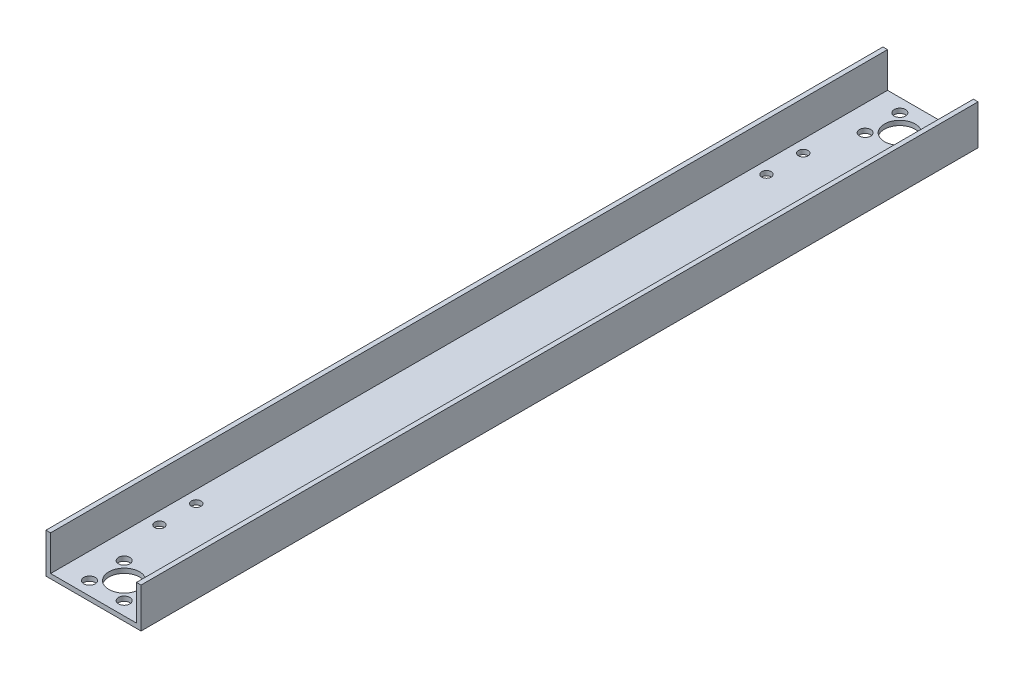
ISO-10303-21;
HEADER;
FILE_DESCRIPTION(('STEP AP214'),'2;1');
FILE_NAME('part.step','',(''),(''),'','','');
FILE_SCHEMA(('AUTOMOTIVE_DESIGN { 1 0 10303 214 1 1 1 1 }'));
ENDSEC;
DATA;
#1=APPLICATION_CONTEXT('core data for automotive mechanical design processes');
#2=APPLICATION_PROTOCOL_DEFINITION('international standard','automotive_design',2000,#1);
#3=PRODUCT_CONTEXT('',#1,'mechanical');
#4=PRODUCT('Part','Part','',(#3));
#5=PRODUCT_RELATED_PRODUCT_CATEGORY('part','',(#4));
#6=PRODUCT_DEFINITION_FORMATION('','',#4);
#7=PRODUCT_DEFINITION_CONTEXT('part definition',#1,'design');
#8=PRODUCT_DEFINITION('design','',#6,#7);
#9=PRODUCT_DEFINITION_SHAPE('','',#8);
#10=(LENGTH_UNIT() NAMED_UNIT(*) SI_UNIT(.MILLI.,.METRE.));
#11=(NAMED_UNIT(*) PLANE_ANGLE_UNIT() SI_UNIT($,.RADIAN.));
#12=(NAMED_UNIT(*) SI_UNIT($,.STERADIAN.) SOLID_ANGLE_UNIT());
#13=UNCERTAINTY_MEASURE_WITH_UNIT(LENGTH_MEASURE(1.E-05),#10,'distance_accuracy_value','');
#14=(GEOMETRIC_REPRESENTATION_CONTEXT(3) GLOBAL_UNCERTAINTY_ASSIGNED_CONTEXT((#13)) GLOBAL_UNIT_ASSIGNED_CONTEXT((#10,
#11,#12)) REPRESENTATION_CONTEXT('',''));
#15=CARTESIAN_POINT('',(0.,0.,0.));
#16=DIRECTION('',(0.,0.,1.));
#17=DIRECTION('',(1.,0.,0.));
#18=AXIS2_PLACEMENT_3D('',#15,#16,#17);
#19=CARTESIAN_POINT('',(15.5,6.5,273.));
#20=DIRECTION('',(-1.,0.,0.));
#21=DIRECTION('',(0.,0.,1.));
#22=AXIS2_PLACEMENT_3D('',#19,#20,#21);
#23=PLANE('',#22);
#24=DIRECTION('',(0.,1.,0.));
#25=VECTOR('',#24,1.);
#26=CARTESIAN_POINT('',(15.5,6.5,0.));
#27=LINE('',#26,#25);
#28=CARTESIAN_POINT('',(15.5,-6.5,0.));
#29=VERTEX_POINT('',#28);
#30=CARTESIAN_POINT('',(15.5,6.5,0.));
#31=VERTEX_POINT('',#30);
#32=EDGE_CURVE('E130',#29,#31,#27,.T.);
#33=ORIENTED_EDGE('',*,*,#32,.T.);
#34=DIRECTION('',(0.,0.,-1.));
#35=VECTOR('',#34,1.);
#36=CARTESIAN_POINT('',(15.5,6.5,273.));
#37=LINE('',#36,#35);
#38=CARTESIAN_POINT('',(15.5,6.5,273.));
#39=VERTEX_POINT('',#38);
#40=EDGE_CURVE('E11',#39,#31,#37,.T.);
#41=ORIENTED_EDGE('',*,*,#40,.F.);
#42=DIRECTION('',(0.,1.,0.));
#43=VECTOR('',#42,1.);
#44=CARTESIAN_POINT('',(15.5,6.5,273.));
#45=LINE('',#44,#43);
#46=CARTESIAN_POINT('',(15.5,-6.5,273.));
#47=VERTEX_POINT('',#46);
#48=EDGE_CURVE('E145',#47,#39,#45,.T.);
#49=ORIENTED_EDGE('',*,*,#48,.F.);
#50=DIRECTION('',(0.,0.,-1.));
#51=VECTOR('',#50,1.);
#52=CARTESIAN_POINT('',(15.5,-6.5,273.));
#53=LINE('',#52,#51);
#54=EDGE_CURVE('E126',#47,#29,#53,.T.);
#55=ORIENTED_EDGE('',*,*,#54,.T.);
#56=EDGE_LOOP('',(#33,#41,#49,#55));
#57=FACE_BOUND('',#56,.T.);
#58=ADVANCED_FACE('F32',(#57),#23,.F.);
#59=CARTESIAN_POINT('',(14.,6.5,273.));
#60=DIRECTION('',(0.,-1.,0.));
#61=DIRECTION('',(0.,0.,-1.));
#62=AXIS2_PLACEMENT_3D('',#59,#60,#61);
#63=PLANE('',#62);
#64=DIRECTION('',(-1.,0.,0.));
#65=VECTOR('',#64,1.);
#66=CARTESIAN_POINT('',(14.,6.5,0.));
#67=LINE('',#66,#65);
#68=CARTESIAN_POINT('',(14.,6.5,0.));
#69=VERTEX_POINT('',#68);
#70=EDGE_CURVE('E133',#31,#69,#67,.T.);
#71=ORIENTED_EDGE('',*,*,#70,.T.);
#72=DIRECTION('',(0.,0.,-1.));
#73=VECTOR('',#72,1.);
#74=CARTESIAN_POINT('',(14.,6.5,273.));
#75=LINE('',#74,#73);
#76=CARTESIAN_POINT('',(14.,6.5,273.));
#77=VERTEX_POINT('',#76);
#78=EDGE_CURVE('E41',#77,#69,#75,.T.);
#79=ORIENTED_EDGE('',*,*,#78,.F.);
#80=DIRECTION('',(-1.,0.,0.));
#81=VECTOR('',#80,1.);
#82=CARTESIAN_POINT('',(14.,6.5,273.));
#83=LINE('',#82,#81);
#84=EDGE_CURVE('E93',#39,#77,#83,.T.);
#85=ORIENTED_EDGE('',*,*,#84,.F.);
#86=ORIENTED_EDGE('',*,*,#40,.T.);
#87=EDGE_LOOP('',(#71,#79,#85,#86));
#88=FACE_BOUND('',#87,.T.);
#89=ADVANCED_FACE('F253',(#88),#63,.F.);
#90=CARTESIAN_POINT('',(14.,6.5,273.));
#91=DIRECTION('',(1.,0.,0.));
#92=DIRECTION('',(0.,1.,0.));
#93=AXIS2_PLACEMENT_3D('',#90,#91,#92);
#94=PLANE('',#93);
#95=DIRECTION('',(0.,-1.,0.));
#96=VECTOR('',#95,1.);
#97=CARTESIAN_POINT('',(14.,6.5,0.));
#98=LINE('',#97,#96);
#99=CARTESIAN_POINT('',(14.,-5.,0.));
#100=VERTEX_POINT('',#99);
#101=EDGE_CURVE('E136',#69,#100,#98,.T.);
#102=ORIENTED_EDGE('',*,*,#101,.T.);
#103=DIRECTION('',(0.,0.,-1.));
#104=VECTOR('',#103,1.);
#105=CARTESIAN_POINT('',(14.,-5.,273.));
#106=LINE('',#105,#104);
#107=CARTESIAN_POINT('',(14.,-5.,273.));
#108=VERTEX_POINT('',#107);
#109=EDGE_CURVE('E152',#108,#100,#106,.T.);
#110=ORIENTED_EDGE('',*,*,#109,.F.);
#111=DIRECTION('',(0.,-1.,0.));
#112=VECTOR('',#111,1.);
#113=CARTESIAN_POINT('',(14.,6.5,273.));
#114=LINE('',#113,#112);
#115=EDGE_CURVE('E219',#77,#108,#114,.T.);
#116=ORIENTED_EDGE('',*,*,#115,.F.);
#117=ORIENTED_EDGE('',*,*,#78,.T.);
#118=EDGE_LOOP('',(#102,#110,#116,#117));
#119=FACE_BOUND('',#118,.T.);
#120=ADVANCED_FACE('F257',(#119),#94,.F.);
#121=CARTESIAN_POINT('',(-14.,-5.,273.));
#122=DIRECTION('',(0.,-1.,0.));
#123=DIRECTION('',(0.,0.,-1.));
#124=AXIS2_PLACEMENT_3D('',#121,#122,#123);
#125=PLANE('',#124);
#126=CARTESIAN_POINT('',(-9.99999999999966,-5.,43.500000000067));
#127=DIRECTION('',(0.,-1.,0.));
#128=DIRECTION('',(0.,0.,-1.));
#129=AXIS2_PLACEMENT_3D('',#126,#127,#128);
#130=CIRCLE('',#129,1.55);
#131=CARTESIAN_POINT('',(-9.99999999999966,-5.,41.950000000067));
#132=VERTEX_POINT('',#131);
#133=EDGE_CURVE('E491',#132,#132,#130,.T.);
#134=ORIENTED_EDGE('',*,*,#133,.T.);
#135=EDGE_LOOP('',(#134));
#136=FACE_BOUND('',#135,.T.);
#137=CARTESIAN_POINT('',(-9.99999999999966,-5.,31.5000000000671));
#138=DIRECTION('',(0.,-1.,0.));
#139=DIRECTION('',(0.,0.,-1.));
#140=AXIS2_PLACEMENT_3D('',#137,#138,#139);
#141=CIRCLE('',#140,1.55);
#142=CARTESIAN_POINT('',(-9.99999999999966,-5.,29.9500000000671));
#143=VERTEX_POINT('',#142);
#144=EDGE_CURVE('E495',#143,#143,#141,.T.);
#145=ORIENTED_EDGE('',*,*,#144,.T.);
#146=EDGE_LOOP('',(#145));
#147=FACE_BOUND('',#146,.T.);
#148=CARTESIAN_POINT('',(10.0000000000003,-5.,43.5000000000671));
#149=DIRECTION('',(0.,-1.,0.));
#150=DIRECTION('',(0.,0.,-1.));
#151=AXIS2_PLACEMENT_3D('',#148,#149,#150);
#152=CIRCLE('',#151,1.54999999999999);
#153=CARTESIAN_POINT('',(10.0000000000003,-5.,41.9500000000671));
#154=VERTEX_POINT('',#153);
#155=EDGE_CURVE('E504',#154,#154,#152,.T.);
#156=ORIENTED_EDGE('',*,*,#155,.T.);
#157=EDGE_LOOP('',(#156));
#158=FACE_BOUND('',#157,.T.);
#159=CARTESIAN_POINT('',(10.0000000000003,-5.,31.5000000000671));
#160=DIRECTION('',(0.,-1.,0.));
#161=DIRECTION('',(0.,0.,-1.));
#162=AXIS2_PLACEMENT_3D('',#159,#160,#161);
#163=CIRCLE('',#162,1.55);
#164=CARTESIAN_POINT('',(10.0000000000003,-5.,29.9500000000671));
#165=VERTEX_POINT('',#164);
#166=EDGE_CURVE('E510',#165,#165,#163,.T.);
#167=ORIENTED_EDGE('',*,*,#166,.T.);
#168=EDGE_LOOP('',(#167));
#169=FACE_BOUND('',#168,.T.);
#170=CARTESIAN_POINT('',(10.0000000000003,-5.,241.500000000066));
#171=DIRECTION('',(0.,-1.,0.));
#172=DIRECTION('',(0.,0.,-1.));
#173=AXIS2_PLACEMENT_3D('',#170,#171,#172);
#174=CIRCLE('',#173,1.55);
#175=CARTESIAN_POINT('',(10.0000000000003,-5.,239.950000000066));
#176=VERTEX_POINT('',#175);
#177=EDGE_CURVE('E516',#176,#176,#174,.T.);
#178=ORIENTED_EDGE('',*,*,#177,.T.);
#179=EDGE_LOOP('',(#178));
#180=FACE_BOUND('',#179,.T.);
#181=CARTESIAN_POINT('',(10.0000000000002,-5.,229.500000000066));
#182=DIRECTION('',(0.,-1.,0.));
#183=DIRECTION('',(0.,0.,-1.));
#184=AXIS2_PLACEMENT_3D('',#181,#182,#183);
#185=CIRCLE('',#184,1.54999999999999);
#186=CARTESIAN_POINT('',(10.0000000000002,-5.,227.950000000066));
#187=VERTEX_POINT('',#186);
#188=EDGE_CURVE('E522',#187,#187,#185,.T.);
#189=ORIENTED_EDGE('',*,*,#188,.T.);
#190=EDGE_LOOP('',(#189));
#191=FACE_BOUND('',#190,.T.);
#192=CARTESIAN_POINT('',(-9.99999999999973,-5.,241.500000000066));
#193=DIRECTION('',(0.,-1.,0.));
#194=DIRECTION('',(0.,0.,-1.));
#195=AXIS2_PLACEMENT_3D('',#192,#193,#194);
#196=CIRCLE('',#195,1.54999999999999);
#197=CARTESIAN_POINT('',(-9.99999999999973,-5.,239.950000000066));
#198=VERTEX_POINT('',#197);
#199=EDGE_CURVE('E528',#198,#198,#196,.T.);
#200=ORIENTED_EDGE('',*,*,#199,.T.);
#201=EDGE_LOOP('',(#200));
#202=FACE_BOUND('',#201,.T.);
#203=CARTESIAN_POINT('',(-9.99999999999976,-5.,229.500000000066));
#204=DIRECTION('',(0.,-1.,0.));
#205=DIRECTION('',(0.,0.,-1.));
#206=AXIS2_PLACEMENT_3D('',#203,#204,#205);
#207=CIRCLE('',#206,1.54999999999997);
#208=CARTESIAN_POINT('',(-9.99999999999976,-5.,227.950000000066));
#209=VERTEX_POINT('',#208);
#210=EDGE_CURVE('E533',#209,#209,#207,.T.);
#211=ORIENTED_EDGE('',*,*,#210,.T.);
#212=EDGE_LOOP('',(#211));
#213=FACE_BOUND('',#212,.T.);
#214=CARTESIAN_POINT('',(0.,-5.,10.));
#215=DIRECTION('',(0.,1.,0.));
#216=DIRECTION('',(0.,0.,-1.));
#217=AXIS2_PLACEMENT_3D('',#214,#215,#216);
#218=CIRCLE('',#217,5.);
#219=CARTESIAN_POINT('',(0.,-5.,5.00000000000001));
#220=VERTEX_POINT('',#219);
#221=EDGE_CURVE('E199',#220,#220,#218,.T.);
#222=ORIENTED_EDGE('',*,*,#221,.F.);
#223=EDGE_LOOP('',(#222));
#224=FACE_BOUND('',#223,.T.);
#225=CARTESIAN_POINT('',(-5.65685424949236,-5.,15.6568542494924));
#226=DIRECTION('',(0.,1.,0.));
#227=DIRECTION('',(0.,0.,-1.));
#228=AXIS2_PLACEMENT_3D('',#225,#226,#227);
#229=CIRCLE('',#228,1.85);
#230=CARTESIAN_POINT('',(-5.65685424949236,-5.,13.8068542494924));
#231=VERTEX_POINT('',#230);
#232=EDGE_CURVE('E189',#231,#231,#229,.T.);
#233=ORIENTED_EDGE('',*,*,#232,.F.);
#234=EDGE_LOOP('',(#233));
#235=FACE_BOUND('',#234,.T.);
#236=CARTESIAN_POINT('',(5.6568542494924,-5.,15.6568542494924));
#237=DIRECTION('',(0.,1.,0.));
#238=DIRECTION('',(0.,0.,-1.));
#239=AXIS2_PLACEMENT_3D('',#236,#237,#238);
#240=CIRCLE('',#239,1.85);
#241=CARTESIAN_POINT('',(5.6568542494924,-5.,13.8068542494924));
#242=VERTEX_POINT('',#241);
#243=EDGE_CURVE('E186',#242,#242,#240,.T.);
#244=ORIENTED_EDGE('',*,*,#243,.F.);
#245=EDGE_LOOP('',(#244));
#246=FACE_BOUND('',#245,.T.);
#247=CARTESIAN_POINT('',(5.6568542494924,-5.,4.34314575050765));
#248=DIRECTION('',(0.,1.,0.));
#249=DIRECTION('',(0.,0.,-1.));
#250=AXIS2_PLACEMENT_3D('',#247,#248,#249);
#251=CIRCLE('',#250,1.85);
#252=CARTESIAN_POINT('',(5.6568542494924,-5.,2.49314575050765));
#253=VERTEX_POINT('',#252);
#254=EDGE_CURVE('E183',#253,#253,#251,.T.);
#255=ORIENTED_EDGE('',*,*,#254,.F.);
#256=EDGE_LOOP('',(#255));
#257=FACE_BOUND('',#256,.T.);
#258=CARTESIAN_POINT('',(-5.6568542494923,-5.,4.34314575050765));
#259=DIRECTION('',(0.,1.,0.));
#260=DIRECTION('',(0.,0.,-1.));
#261=AXIS2_PLACEMENT_3D('',#258,#259,#260);
#262=CIRCLE('',#261,1.85);
#263=CARTESIAN_POINT('',(-5.6568542494923,-5.,2.49314575050765));
#264=VERTEX_POINT('',#263);
#265=EDGE_CURVE('E179',#264,#264,#262,.T.);
#266=ORIENTED_EDGE('',*,*,#265,.F.);
#267=EDGE_LOOP('',(#266));
#268=FACE_BOUND('',#267,.T.);
#269=CARTESIAN_POINT('',(-5.6568542494923,-5.,268.656854249492));
#270=DIRECTION('',(0.,1.,0.));
#271=DIRECTION('',(0.,0.,1.));
#272=AXIS2_PLACEMENT_3D('',#269,#270,#271);
#273=CIRCLE('',#272,1.85);
#274=CARTESIAN_POINT('',(-5.6568542494923,-5.,270.506854249492));
#275=VERTEX_POINT('',#274);
#276=EDGE_CURVE('E175',#275,#275,#273,.T.);
#277=ORIENTED_EDGE('',*,*,#276,.F.);
#278=EDGE_LOOP('',(#277));
#279=FACE_BOUND('',#278,.T.);
#280=CARTESIAN_POINT('',(5.6568542494924,-5.,268.656854249492));
#281=DIRECTION('',(0.,1.,0.));
#282=DIRECTION('',(0.,0.,1.));
#283=AXIS2_PLACEMENT_3D('',#280,#281,#282);
#284=CIRCLE('',#283,1.85);
#285=CARTESIAN_POINT('',(5.6568542494924,-5.,270.506854249492));
#286=VERTEX_POINT('',#285);
#287=EDGE_CURVE('E171',#286,#286,#284,.T.);
#288=ORIENTED_EDGE('',*,*,#287,.F.);
#289=EDGE_LOOP('',(#288));
#290=FACE_BOUND('',#289,.T.);
#291=CARTESIAN_POINT('',(5.6568542494924,-5.,257.343145750508));
#292=DIRECTION('',(0.,1.,0.));
#293=DIRECTION('',(0.,0.,1.));
#294=AXIS2_PLACEMENT_3D('',#291,#292,#293);
#295=CIRCLE('',#294,1.85);
#296=CARTESIAN_POINT('',(5.6568542494924,-5.,259.193145750508));
#297=VERTEX_POINT('',#296);
#298=EDGE_CURVE('E167',#297,#297,#295,.T.);
#299=ORIENTED_EDGE('',*,*,#298,.F.);
#300=EDGE_LOOP('',(#299));
#301=FACE_BOUND('',#300,.T.);
#302=CARTESIAN_POINT('',(-5.65685424949236,-5.,257.343145750508));
#303=DIRECTION('',(0.,1.,0.));
#304=DIRECTION('',(0.,0.,1.));
#305=AXIS2_PLACEMENT_3D('',#302,#303,#304);
#306=CIRCLE('',#305,1.85);
#307=CARTESIAN_POINT('',(-5.65685424949236,-5.,259.193145750508));
#308=VERTEX_POINT('',#307);
#309=EDGE_CURVE('E163',#308,#308,#306,.T.);
#310=ORIENTED_EDGE('',*,*,#309,.F.);
#311=EDGE_LOOP('',(#310));
#312=FACE_BOUND('',#311,.T.);
#313=CARTESIAN_POINT('',(0.,-5.,263.));
#314=DIRECTION('',(0.,1.,0.));
#315=DIRECTION('',(0.,0.,1.));
#316=AXIS2_PLACEMENT_3D('',#313,#314,#315);
#317=CIRCLE('',#316,5.);
#318=CARTESIAN_POINT('',(0.,-5.,268.));
#319=VERTEX_POINT('',#318);
#320=EDGE_CURVE('E159',#319,#319,#317,.T.);
#321=ORIENTED_EDGE('',*,*,#320,.F.);
#322=EDGE_LOOP('',(#321));
#323=FACE_BOUND('',#322,.T.);
#324=DIRECTION('',(-1.,0.,0.));
#325=VECTOR('',#324,1.);
#326=CARTESIAN_POINT('',(-14.,-5.,0.));
#327=LINE('',#326,#325);
#328=CARTESIAN_POINT('',(-14.,-5.,0.));
#329=VERTEX_POINT('',#328);
#330=EDGE_CURVE('E138',#100,#329,#327,.T.);
#331=ORIENTED_EDGE('',*,*,#330,.T.);
#332=DIRECTION('',(0.,0.,-1.));
#333=VECTOR('',#332,1.);
#334=CARTESIAN_POINT('',(-14.,-5.,273.));
#335=LINE('',#334,#333);
#336=CARTESIAN_POINT('',(-14.,-5.,273.));
#337=VERTEX_POINT('',#336);
#338=EDGE_CURVE('E149',#337,#329,#335,.T.);
#339=ORIENTED_EDGE('',*,*,#338,.F.);
#340=DIRECTION('',(-1.,0.,0.));
#341=VECTOR('',#340,1.);
#342=CARTESIAN_POINT('',(-14.,-5.,273.));
#343=LINE('',#342,#341);
#344=EDGE_CURVE('E221',#108,#337,#343,.T.);
#345=ORIENTED_EDGE('',*,*,#344,.F.);
#346=ORIENTED_EDGE('',*,*,#109,.T.);
#347=EDGE_LOOP('',(#331,#339,#345,#346));
#348=FACE_BOUND('',#347,.T.);
#349=ADVANCED_FACE('F227',(#136,#147,#158,#169,#180,#191,#202,#213,#224,#235,#246,#257,#268,
#279,#290,#301,#312,#323,#348),#125,.F.);
#350=CARTESIAN_POINT('',(-14.,6.5,273.));
#351=DIRECTION('',(-1.,0.,0.));
#352=DIRECTION('',(0.,-1.,0.));
#353=AXIS2_PLACEMENT_3D('',#350,#351,#352);
#354=PLANE('',#353);
#355=DIRECTION('',(0.,1.,0.));
#356=VECTOR('',#355,1.);
#357=CARTESIAN_POINT('',(-14.,6.5,0.));
#358=LINE('',#357,#356);
#359=CARTESIAN_POINT('',(-14.,6.5,0.));
#360=VERTEX_POINT('',#359);
#361=EDGE_CURVE('E140',#329,#360,#358,.T.);
#362=ORIENTED_EDGE('',*,*,#361,.T.);
#363=DIRECTION('',(0.,0.,-1.));
#364=VECTOR('',#363,1.);
#365=CARTESIAN_POINT('',(-14.,6.5,273.));
#366=LINE('',#365,#364);
#367=CARTESIAN_POINT('',(-14.,6.5,273.));
#368=VERTEX_POINT('',#367);
#369=EDGE_CURVE('E121',#368,#360,#366,.T.);
#370=ORIENTED_EDGE('',*,*,#369,.F.);
#371=DIRECTION('',(0.,1.,0.));
#372=VECTOR('',#371,1.);
#373=CARTESIAN_POINT('',(-14.,6.5,273.));
#374=LINE('',#373,#372);
#375=EDGE_CURVE('E112',#337,#368,#374,.T.);
#376=ORIENTED_EDGE('',*,*,#375,.F.);
#377=ORIENTED_EDGE('',*,*,#338,.T.);
#378=EDGE_LOOP('',(#362,#370,#376,#377));
#379=FACE_BOUND('',#378,.T.);
#380=ADVANCED_FACE('F231',(#379),#354,.F.);
#381=CARTESIAN_POINT('',(-15.5,6.5,273.));
#382=DIRECTION('',(0.,-1.,0.));
#383=DIRECTION('',(0.,0.,-1.));
#384=AXIS2_PLACEMENT_3D('',#381,#382,#383);
#385=PLANE('',#384);
#386=DIRECTION('',(-1.,0.,0.));
#387=VECTOR('',#386,1.);
#388=CARTESIAN_POINT('',(-15.5,6.5,0.));
#389=LINE('',#388,#387);
#390=CARTESIAN_POINT('',(-15.5,6.5,0.));
#391=VERTEX_POINT('',#390);
#392=EDGE_CURVE('E120',#360,#391,#389,.T.);
#393=ORIENTED_EDGE('',*,*,#392,.T.);
#394=DIRECTION('',(0.,0.,-1.));
#395=VECTOR('',#394,1.);
#396=CARTESIAN_POINT('',(-15.5,6.5,273.));
#397=LINE('',#396,#395);
#398=CARTESIAN_POINT('',(-15.5,6.5,273.));
#399=VERTEX_POINT('',#398);
#400=EDGE_CURVE('E117',#399,#391,#397,.T.);
#401=ORIENTED_EDGE('',*,*,#400,.F.);
#402=DIRECTION('',(-1.,0.,0.));
#403=VECTOR('',#402,1.);
#404=CARTESIAN_POINT('',(-15.5,6.5,273.));
#405=LINE('',#404,#403);
#406=EDGE_CURVE('E106',#368,#399,#405,.T.);
#407=ORIENTED_EDGE('',*,*,#406,.F.);
#408=ORIENTED_EDGE('',*,*,#369,.T.);
#409=EDGE_LOOP('',(#393,#401,#407,#408));
#410=FACE_BOUND('',#409,.T.);
#411=ADVANCED_FACE('F118',(#410),#385,.F.);
#412=CARTESIAN_POINT('',(-15.5,6.5,273.));
#413=DIRECTION('',(1.,0.,0.));
#414=DIRECTION('',(0.,0.,-1.));
#415=AXIS2_PLACEMENT_3D('',#412,#413,#414);
#416=PLANE('',#415);
#417=DIRECTION('',(0.,-1.,0.));
#418=VECTOR('',#417,1.);
#419=CARTESIAN_POINT('',(-15.5,6.5,0.));
#420=LINE('',#419,#418);
#421=CARTESIAN_POINT('',(-15.5,-6.5,0.));
#422=VERTEX_POINT('',#421);
#423=EDGE_CURVE('E79',#391,#422,#420,.T.);
#424=ORIENTED_EDGE('',*,*,#423,.T.);
#425=DIRECTION('',(0.,0.,-1.));
#426=VECTOR('',#425,1.);
#427=CARTESIAN_POINT('',(-15.5,-6.5,273.));
#428=LINE('',#427,#426);
#429=CARTESIAN_POINT('',(-15.5,-6.5,273.));
#430=VERTEX_POINT('',#429);
#431=EDGE_CURVE('E122',#430,#422,#428,.T.);
#432=ORIENTED_EDGE('',*,*,#431,.F.);
#433=DIRECTION('',(0.,-1.,0.));
#434=VECTOR('',#433,1.);
#435=CARTESIAN_POINT('',(-15.5,6.5,273.));
#436=LINE('',#435,#434);
#437=EDGE_CURVE('E110',#399,#430,#436,.T.);
#438=ORIENTED_EDGE('',*,*,#437,.F.);
#439=ORIENTED_EDGE('',*,*,#400,.T.);
#440=EDGE_LOOP('',(#424,#432,#438,#439));
#441=FACE_BOUND('',#440,.T.);
#442=ADVANCED_FACE('F124',(#441),#416,.F.);
#443=CARTESIAN_POINT('',(-15.5,-6.5,273.));
#444=DIRECTION('',(0.,1.,0.));
#445=DIRECTION('',(0.,0.,1.));
#446=AXIS2_PLACEMENT_3D('',#443,#444,#445);
#447=PLANE('',#446);
#448=CARTESIAN_POINT('',(-9.99999999999966,-6.5,43.500000000067));
#449=DIRECTION('',(0.,-1.,0.));
#450=DIRECTION('',(0.,0.,-1.));
#451=AXIS2_PLACEMENT_3D('',#448,#449,#450);
#452=CIRCLE('',#451,1.55);
#453=CARTESIAN_POINT('',(-9.99999999999966,-6.5,41.950000000067));
#454=VERTEX_POINT('',#453);
#455=EDGE_CURVE('E488',#454,#454,#452,.T.);
#456=ORIENTED_EDGE('',*,*,#455,.F.);
#457=EDGE_LOOP('',(#456));
#458=FACE_BOUND('',#457,.T.);
#459=CARTESIAN_POINT('',(-9.99999999999966,-6.5,31.5000000000671));
#460=DIRECTION('',(0.,-1.,0.));
#461=DIRECTION('',(0.,0.,-1.));
#462=AXIS2_PLACEMENT_3D('',#459,#460,#461);
#463=CIRCLE('',#462,1.55);
#464=CARTESIAN_POINT('',(-9.99999999999966,-6.5,29.9500000000671));
#465=VERTEX_POINT('',#464);
#466=EDGE_CURVE('E492',#465,#465,#463,.T.);
#467=ORIENTED_EDGE('',*,*,#466,.F.);
#468=EDGE_LOOP('',(#467));
#469=FACE_BOUND('',#468,.T.);
#470=CARTESIAN_POINT('',(10.0000000000003,-6.5,43.5000000000671));
#471=DIRECTION('',(0.,-1.,0.));
#472=DIRECTION('',(0.,0.,-1.));
#473=AXIS2_PLACEMENT_3D('',#470,#471,#472);
#474=CIRCLE('',#473,1.54999999999999);
#475=CARTESIAN_POINT('',(10.0000000000003,-6.5,41.9500000000671));
#476=VERTEX_POINT('',#475);
#477=EDGE_CURVE('E501',#476,#476,#474,.T.);
#478=ORIENTED_EDGE('',*,*,#477,.F.);
#479=EDGE_LOOP('',(#478));
#480=FACE_BOUND('',#479,.T.);
#481=CARTESIAN_POINT('',(10.0000000000003,-6.5,31.5000000000671));
#482=DIRECTION('',(0.,-1.,0.));
#483=DIRECTION('',(0.,0.,-1.));
#484=AXIS2_PLACEMENT_3D('',#481,#482,#483);
#485=CIRCLE('',#484,1.55);
#486=CARTESIAN_POINT('',(10.0000000000003,-6.5,29.9500000000671));
#487=VERTEX_POINT('',#486);
#488=EDGE_CURVE('E507',#487,#487,#485,.T.);
#489=ORIENTED_EDGE('',*,*,#488,.F.);
#490=EDGE_LOOP('',(#489));
#491=FACE_BOUND('',#490,.T.);
#492=CARTESIAN_POINT('',(10.0000000000003,-6.5,241.500000000066));
#493=DIRECTION('',(0.,-1.,0.));
#494=DIRECTION('',(0.,0.,-1.));
#495=AXIS2_PLACEMENT_3D('',#492,#493,#494);
#496=CIRCLE('',#495,1.55);
#497=CARTESIAN_POINT('',(10.0000000000003,-6.5,239.950000000066));
#498=VERTEX_POINT('',#497);
#499=EDGE_CURVE('E513',#498,#498,#496,.T.);
#500=ORIENTED_EDGE('',*,*,#499,.F.);
#501=EDGE_LOOP('',(#500));
#502=FACE_BOUND('',#501,.T.);
#503=CARTESIAN_POINT('',(10.0000000000002,-6.5,229.500000000066));
#504=DIRECTION('',(0.,-1.,0.));
#505=DIRECTION('',(0.,0.,-1.));
#506=AXIS2_PLACEMENT_3D('',#503,#504,#505);
#507=CIRCLE('',#506,1.54999999999999);
#508=CARTESIAN_POINT('',(10.0000000000002,-6.5,227.950000000066));
#509=VERTEX_POINT('',#508);
#510=EDGE_CURVE('E519',#509,#509,#507,.T.);
#511=ORIENTED_EDGE('',*,*,#510,.F.);
#512=EDGE_LOOP('',(#511));
#513=FACE_BOUND('',#512,.T.);
#514=CARTESIAN_POINT('',(-9.99999999999973,-6.5,241.500000000066));
#515=DIRECTION('',(0.,-1.,0.));
#516=DIRECTION('',(0.,0.,-1.));
#517=AXIS2_PLACEMENT_3D('',#514,#515,#516);
#518=CIRCLE('',#517,1.54999999999999);
#519=CARTESIAN_POINT('',(-9.99999999999973,-6.5,239.950000000066));
#520=VERTEX_POINT('',#519);
#521=EDGE_CURVE('E525',#520,#520,#518,.T.);
#522=ORIENTED_EDGE('',*,*,#521,.F.);
#523=EDGE_LOOP('',(#522));
#524=FACE_BOUND('',#523,.T.);
#525=CARTESIAN_POINT('',(-9.99999999999976,-6.5,229.500000000066));
#526=DIRECTION('',(0.,-1.,0.));
#527=DIRECTION('',(0.,0.,-1.));
#528=AXIS2_PLACEMENT_3D('',#525,#526,#527);
#529=CIRCLE('',#528,1.54999999999997);
#530=CARTESIAN_POINT('',(-9.99999999999976,-6.5,227.950000000066));
#531=VERTEX_POINT('',#530);
#532=EDGE_CURVE('E531',#531,#531,#529,.T.);
#533=ORIENTED_EDGE('',*,*,#532,.F.);
#534=EDGE_LOOP('',(#533));
#535=FACE_BOUND('',#534,.T.);
#536=CARTESIAN_POINT('',(0.,-6.50000000000001,10.));
#537=DIRECTION('',(0.,1.,0.));
#538=DIRECTION('',(0.,0.,1.));
#539=AXIS2_PLACEMENT_3D('',#536,#537,#538);
#540=CIRCLE('',#539,5.);
#541=CARTESIAN_POINT('',(0.,-6.50000000000001,15.));
#542=VERTEX_POINT('',#541);
#543=EDGE_CURVE('E35',#542,#542,#540,.T.);
#544=ORIENTED_EDGE('',*,*,#543,.T.);
#545=EDGE_LOOP('',(#544));
#546=FACE_BOUND('',#545,.T.);
#547=CARTESIAN_POINT('',(-5.65685424949236,-6.50000000000001,15.6568542494924));
#548=DIRECTION('',(0.,1.,0.));
#549=DIRECTION('',(0.,0.,1.));
#550=AXIS2_PLACEMENT_3D('',#547,#548,#549);
#551=CIRCLE('',#550,1.85);
#552=CARTESIAN_POINT('',(-5.65685424949236,-6.50000000000001,17.5068542494924));
#553=VERTEX_POINT('',#552);
#554=EDGE_CURVE('E187',#553,#553,#551,.T.);
#555=ORIENTED_EDGE('',*,*,#554,.T.);
#556=EDGE_LOOP('',(#555));
#557=FACE_BOUND('',#556,.T.);
#558=CARTESIAN_POINT('',(5.6568542494924,-6.50000000000001,15.6568542494924));
#559=DIRECTION('',(0.,1.,0.));
#560=DIRECTION('',(0.,0.,1.));
#561=AXIS2_PLACEMENT_3D('',#558,#559,#560);
#562=CIRCLE('',#561,1.85);
#563=CARTESIAN_POINT('',(5.6568542494924,-6.50000000000001,17.5068542494924));
#564=VERTEX_POINT('',#563);
#565=EDGE_CURVE('E184',#564,#564,#562,.T.);
#566=ORIENTED_EDGE('',*,*,#565,.T.);
#567=EDGE_LOOP('',(#566));
#568=FACE_BOUND('',#567,.T.);
#569=CARTESIAN_POINT('',(5.6568542494924,-6.50000000000001,4.34314575050765));
#570=DIRECTION('',(0.,1.,0.));
#571=DIRECTION('',(0.,0.,1.));
#572=AXIS2_PLACEMENT_3D('',#569,#570,#571);
#573=CIRCLE('',#572,1.85);
#574=CARTESIAN_POINT('',(5.6568542494924,-6.50000000000001,6.19314575050765));
#575=VERTEX_POINT('',#574);
#576=EDGE_CURVE('E180',#575,#575,#573,.T.);
#577=ORIENTED_EDGE('',*,*,#576,.T.);
#578=EDGE_LOOP('',(#577));
#579=FACE_BOUND('',#578,.T.);
#580=CARTESIAN_POINT('',(-5.6568542494923,-6.50000000000001,4.34314575050765));
#581=DIRECTION('',(0.,1.,0.));
#582=DIRECTION('',(0.,0.,1.));
#583=AXIS2_PLACEMENT_3D('',#580,#581,#582);
#584=CIRCLE('',#583,1.85);
#585=CARTESIAN_POINT('',(-5.6568542494923,-6.50000000000001,6.19314575050765));
#586=VERTEX_POINT('',#585);
#587=EDGE_CURVE('E176',#586,#586,#584,.T.);
#588=ORIENTED_EDGE('',*,*,#587,.T.);
#589=EDGE_LOOP('',(#588));
#590=FACE_BOUND('',#589,.T.);
#591=CARTESIAN_POINT('',(-5.6568542494923,-6.50000000000001,268.656854249492));
#592=DIRECTION('',(0.,1.,0.));
#593=DIRECTION('',(0.,0.,1.));
#594=AXIS2_PLACEMENT_3D('',#591,#592,#593);
#595=CIRCLE('',#594,1.85);
#596=CARTESIAN_POINT('',(-5.6568542494923,-6.50000000000001,270.506854249492));
#597=VERTEX_POINT('',#596);
#598=EDGE_CURVE('E172',#597,#597,#595,.T.);
#599=ORIENTED_EDGE('',*,*,#598,.T.);
#600=EDGE_LOOP('',(#599));
#601=FACE_BOUND('',#600,.T.);
#602=CARTESIAN_POINT('',(5.6568542494924,-6.50000000000001,268.656854249492));
#603=DIRECTION('',(0.,1.,0.));
#604=DIRECTION('',(0.,0.,1.));
#605=AXIS2_PLACEMENT_3D('',#602,#603,#604);
#606=CIRCLE('',#605,1.85);
#607=CARTESIAN_POINT('',(5.6568542494924,-6.50000000000001,270.506854249492));
#608=VERTEX_POINT('',#607);
#609=EDGE_CURVE('E168',#608,#608,#606,.T.);
#610=ORIENTED_EDGE('',*,*,#609,.T.);
#611=EDGE_LOOP('',(#610));
#612=FACE_BOUND('',#611,.T.);
#613=CARTESIAN_POINT('',(5.6568542494924,-6.50000000000001,257.343145750508));
#614=DIRECTION('',(0.,1.,0.));
#615=DIRECTION('',(0.,0.,1.));
#616=AXIS2_PLACEMENT_3D('',#613,#614,#615);
#617=CIRCLE('',#616,1.85);
#618=CARTESIAN_POINT('',(5.6568542494924,-6.50000000000001,259.193145750508));
#619=VERTEX_POINT('',#618);
#620=EDGE_CURVE('E164',#619,#619,#617,.T.);
#621=ORIENTED_EDGE('',*,*,#620,.T.);
#622=EDGE_LOOP('',(#621));
#623=FACE_BOUND('',#622,.T.);
#624=CARTESIAN_POINT('',(-5.65685424949236,-6.50000000000001,257.343145750508));
#625=DIRECTION('',(0.,1.,0.));
#626=DIRECTION('',(0.,0.,1.));
#627=AXIS2_PLACEMENT_3D('',#624,#625,#626);
#628=CIRCLE('',#627,1.85);
#629=CARTESIAN_POINT('',(-5.65685424949236,-6.50000000000001,259.193145750508));
#630=VERTEX_POINT('',#629);
#631=EDGE_CURVE('E160',#630,#630,#628,.T.);
#632=ORIENTED_EDGE('',*,*,#631,.T.);
#633=EDGE_LOOP('',(#632));
#634=FACE_BOUND('',#633,.T.);
#635=CARTESIAN_POINT('',(0.,-6.50000000000001,263.));
#636=DIRECTION('',(0.,1.,0.));
#637=DIRECTION('',(0.,0.,1.));
#638=AXIS2_PLACEMENT_3D('',#635,#636,#637);
#639=CIRCLE('',#638,5.);
#640=CARTESIAN_POINT('',(0.,-6.50000000000001,268.));
#641=VERTEX_POINT('',#640);
#642=EDGE_CURVE('E134',#641,#641,#639,.T.);
#643=ORIENTED_EDGE('',*,*,#642,.T.);
#644=EDGE_LOOP('',(#643));
#645=FACE_BOUND('',#644,.T.);
#646=DIRECTION('',(1.,0.,0.));
#647=VECTOR('',#646,1.);
#648=CARTESIAN_POINT('',(-15.5,-6.5,0.));
#649=LINE('',#648,#647);
#650=EDGE_CURVE('E85',#422,#29,#649,.T.);
#651=ORIENTED_EDGE('',*,*,#650,.T.);
#652=ORIENTED_EDGE('',*,*,#54,.F.);
#653=DIRECTION('',(1.,0.,0.));
#654=VECTOR('',#653,1.);
#655=CARTESIAN_POINT('',(-15.5,-6.5,273.));
#656=LINE('',#655,#654);
#657=EDGE_CURVE('E50',#430,#47,#656,.T.);
#658=ORIENTED_EDGE('',*,*,#657,.F.);
#659=ORIENTED_EDGE('',*,*,#431,.T.);
#660=EDGE_LOOP('',(#651,#652,#658,#659));
#661=FACE_BOUND('',#660,.T.);
#662=ADVANCED_FACE('F239',(#458,#469,#480,#491,#502,#513,#524,#535,#546,#557,#568,#579,#590,
#601,#612,#623,#634,#645,#661),#447,.F.);
#663=CARTESIAN_POINT('',(0.,0.,273.));
#664=DIRECTION('',(0.,0.,1.));
#665=DIRECTION('',(1.,0.,0.));
#666=AXIS2_PLACEMENT_3D('',#663,#664,#665);
#667=PLANE('',#666);
#668=ORIENTED_EDGE('',*,*,#48,.T.);
#669=ORIENTED_EDGE('',*,*,#84,.T.);
#670=ORIENTED_EDGE('',*,*,#115,.T.);
#671=ORIENTED_EDGE('',*,*,#344,.T.);
#672=ORIENTED_EDGE('',*,*,#375,.T.);
#673=ORIENTED_EDGE('',*,*,#406,.T.);
#674=ORIENTED_EDGE('',*,*,#437,.T.);
#675=ORIENTED_EDGE('',*,*,#657,.T.);
#676=EDGE_LOOP('',(#668,#669,#670,#671,#672,#673,#674,#675));
#677=FACE_BOUND('',#676,.T.);
#678=ADVANCED_FACE('F108',(#677),#667,.T.);
#679=CARTESIAN_POINT('',(0.,0.,0.));
#680=DIRECTION('',(0.,0.,1.));
#681=DIRECTION('',(1.,0.,0.));
#682=AXIS2_PLACEMENT_3D('',#679,#680,#681);
#683=PLANE('',#682);
#684=ORIENTED_EDGE('',*,*,#32,.F.);
#685=ORIENTED_EDGE('',*,*,#650,.F.);
#686=ORIENTED_EDGE('',*,*,#423,.F.);
#687=ORIENTED_EDGE('',*,*,#392,.F.);
#688=ORIENTED_EDGE('',*,*,#361,.F.);
#689=ORIENTED_EDGE('',*,*,#330,.F.);
#690=ORIENTED_EDGE('',*,*,#101,.F.);
#691=ORIENTED_EDGE('',*,*,#70,.F.);
#692=EDGE_LOOP('',(#684,#685,#686,#687,#688,#689,#690,#691));
#693=FACE_BOUND('',#692,.T.);
#694=ADVANCED_FACE('F234',(#693),#683,.F.);
#695=CARTESIAN_POINT('',(0.,-278.,263.));
#696=DIRECTION('',(0.,1.,0.));
#697=DIRECTION('',(0.,0.,1.));
#698=AXIS2_PLACEMENT_3D('',#695,#696,#697);
#699=CYLINDRICAL_SURFACE('',#698,5.);
#700=ORIENTED_EDGE('',*,*,#320,.T.);
#701=EDGE_LOOP('',(#700));
#702=FACE_BOUND('',#701,.T.);
#703=ORIENTED_EDGE('',*,*,#642,.F.);
#704=EDGE_LOOP('',(#703));
#705=FACE_BOUND('',#704,.T.);
#706=ADVANCED_FACE('F294',(#702,#705),#699,.F.);
#707=CARTESIAN_POINT('',(-5.65685424949236,-278.,257.343145750508));
#708=DIRECTION('',(0.,1.,0.));
#709=DIRECTION('',(0.,0.,1.));
#710=AXIS2_PLACEMENT_3D('',#707,#708,#709);
#711=CYLINDRICAL_SURFACE('',#710,1.85);
#712=ORIENTED_EDGE('',*,*,#309,.T.);
#713=EDGE_LOOP('',(#712));
#714=FACE_BOUND('',#713,.T.);
#715=ORIENTED_EDGE('',*,*,#631,.F.);
#716=EDGE_LOOP('',(#715));
#717=FACE_BOUND('',#716,.T.);
#718=ADVANCED_FACE('F302',(#714,#717),#711,.F.);
#719=CARTESIAN_POINT('',(5.6568542494924,-278.,257.343145750508));
#720=DIRECTION('',(0.,1.,0.));
#721=DIRECTION('',(0.,0.,1.));
#722=AXIS2_PLACEMENT_3D('',#719,#720,#721);
#723=CYLINDRICAL_SURFACE('',#722,1.85);
#724=ORIENTED_EDGE('',*,*,#298,.T.);
#725=EDGE_LOOP('',(#724));
#726=FACE_BOUND('',#725,.T.);
#727=ORIENTED_EDGE('',*,*,#620,.F.);
#728=EDGE_LOOP('',(#727));
#729=FACE_BOUND('',#728,.T.);
#730=ADVANCED_FACE('F312',(#726,#729),#723,.F.);
#731=CARTESIAN_POINT('',(5.6568542494924,-278.,268.656854249492));
#732=DIRECTION('',(0.,1.,0.));
#733=DIRECTION('',(0.,0.,1.));
#734=AXIS2_PLACEMENT_3D('',#731,#732,#733);
#735=CYLINDRICAL_SURFACE('',#734,1.85);
#736=ORIENTED_EDGE('',*,*,#287,.T.);
#737=EDGE_LOOP('',(#736));
#738=FACE_BOUND('',#737,.T.);
#739=ORIENTED_EDGE('',*,*,#609,.F.);
#740=EDGE_LOOP('',(#739));
#741=FACE_BOUND('',#740,.T.);
#742=ADVANCED_FACE('F322',(#738,#741),#735,.F.);
#743=CARTESIAN_POINT('',(-5.6568542494923,-278.,268.656854249492));
#744=DIRECTION('',(0.,1.,0.));
#745=DIRECTION('',(0.,0.,1.));
#746=AXIS2_PLACEMENT_3D('',#743,#744,#745);
#747=CYLINDRICAL_SURFACE('',#746,1.85);
#748=ORIENTED_EDGE('',*,*,#276,.T.);
#749=EDGE_LOOP('',(#748));
#750=FACE_BOUND('',#749,.T.);
#751=ORIENTED_EDGE('',*,*,#598,.F.);
#752=EDGE_LOOP('',(#751));
#753=FACE_BOUND('',#752,.T.);
#754=ADVANCED_FACE('F332',(#750,#753),#747,.F.);
#755=CARTESIAN_POINT('',(-5.6568542494923,-278.,4.34314575050765));
#756=DIRECTION('',(0.,1.,0.));
#757=DIRECTION('',(0.,0.,1.));
#758=AXIS2_PLACEMENT_3D('',#755,#756,#757);
#759=CYLINDRICAL_SURFACE('',#758,1.85);
#760=ORIENTED_EDGE('',*,*,#265,.T.);
#761=EDGE_LOOP('',(#760));
#762=FACE_BOUND('',#761,.T.);
#763=ORIENTED_EDGE('',*,*,#587,.F.);
#764=EDGE_LOOP('',(#763));
#765=FACE_BOUND('',#764,.T.);
#766=ADVANCED_FACE('F342',(#762,#765),#759,.F.);
#767=CARTESIAN_POINT('',(5.6568542494924,-278.,4.34314575050765));
#768=DIRECTION('',(0.,1.,0.));
#769=DIRECTION('',(0.,0.,1.));
#770=AXIS2_PLACEMENT_3D('',#767,#768,#769);
#771=CYLINDRICAL_SURFACE('',#770,1.85);
#772=ORIENTED_EDGE('',*,*,#254,.T.);
#773=EDGE_LOOP('',(#772));
#774=FACE_BOUND('',#773,.T.);
#775=ORIENTED_EDGE('',*,*,#576,.F.);
#776=EDGE_LOOP('',(#775));
#777=FACE_BOUND('',#776,.T.);
#778=ADVANCED_FACE('F352',(#774,#777),#771,.F.);
#779=CARTESIAN_POINT('',(5.6568542494924,-278.,15.6568542494924));
#780=DIRECTION('',(0.,1.,0.));
#781=DIRECTION('',(0.,0.,1.));
#782=AXIS2_PLACEMENT_3D('',#779,#780,#781);
#783=CYLINDRICAL_SURFACE('',#782,1.85);
#784=ORIENTED_EDGE('',*,*,#243,.T.);
#785=EDGE_LOOP('',(#784));
#786=FACE_BOUND('',#785,.T.);
#787=ORIENTED_EDGE('',*,*,#565,.F.);
#788=EDGE_LOOP('',(#787));
#789=FACE_BOUND('',#788,.T.);
#790=ADVANCED_FACE('F362',(#786,#789),#783,.F.);
#791=CARTESIAN_POINT('',(-5.65685424949236,-278.,15.6568542494924));
#792=DIRECTION('',(0.,1.,0.));
#793=DIRECTION('',(0.,0.,1.));
#794=AXIS2_PLACEMENT_3D('',#791,#792,#793);
#795=CYLINDRICAL_SURFACE('',#794,1.85);
#796=ORIENTED_EDGE('',*,*,#232,.T.);
#797=EDGE_LOOP('',(#796));
#798=FACE_BOUND('',#797,.T.);
#799=ORIENTED_EDGE('',*,*,#554,.F.);
#800=EDGE_LOOP('',(#799));
#801=FACE_BOUND('',#800,.T.);
#802=ADVANCED_FACE('F372',(#798,#801),#795,.F.);
#803=CARTESIAN_POINT('',(0.,-278.,10.));
#804=DIRECTION('',(0.,1.,0.));
#805=DIRECTION('',(0.,0.,1.));
#806=AXIS2_PLACEMENT_3D('',#803,#804,#805);
#807=CYLINDRICAL_SURFACE('',#806,5.);
#808=ORIENTED_EDGE('',*,*,#221,.T.);
#809=EDGE_LOOP('',(#808));
#810=FACE_BOUND('',#809,.T.);
#811=ORIENTED_EDGE('',*,*,#543,.F.);
#812=EDGE_LOOP('',(#811));
#813=FACE_BOUND('',#812,.T.);
#814=ADVANCED_FACE('F382',(#810,#813),#807,.F.);
#815=CARTESIAN_POINT('',(-9.99999999999976,213.5,229.500000000066));
#816=DIRECTION('',(0.,-1.,0.));
#817=DIRECTION('',(0.,0.,-1.));
#818=AXIS2_PLACEMENT_3D('',#815,#816,#817);
#819=CYLINDRICAL_SURFACE('',#818,1.54999999999997);
#820=ORIENTED_EDGE('',*,*,#532,.T.);
#821=EDGE_LOOP('',(#820));
#822=FACE_BOUND('',#821,.T.);
#823=ORIENTED_EDGE('',*,*,#210,.F.);
#824=EDGE_LOOP('',(#823));
#825=FACE_BOUND('',#824,.T.);
#826=ADVANCED_FACE('F391',(#822,#825),#819,.F.);
#827=CARTESIAN_POINT('',(-9.99999999999973,213.5,241.500000000066));
#828=DIRECTION('',(0.,-1.,0.));
#829=DIRECTION('',(0.,0.,-1.));
#830=AXIS2_PLACEMENT_3D('',#827,#828,#829);
#831=CYLINDRICAL_SURFACE('',#830,1.54999999999999);
#832=ORIENTED_EDGE('',*,*,#521,.T.);
#833=EDGE_LOOP('',(#832));
#834=FACE_BOUND('',#833,.T.);
#835=ORIENTED_EDGE('',*,*,#199,.F.);
#836=EDGE_LOOP('',(#835));
#837=FACE_BOUND('',#836,.T.);
#838=ADVANCED_FACE('F412',(#834,#837),#831,.F.);
#839=CARTESIAN_POINT('',(10.0000000000002,213.5,229.500000000066));
#840=DIRECTION('',(0.,-1.,0.));
#841=DIRECTION('',(0.,0.,-1.));
#842=AXIS2_PLACEMENT_3D('',#839,#840,#841);
#843=CYLINDRICAL_SURFACE('',#842,1.54999999999999);
#844=ORIENTED_EDGE('',*,*,#510,.T.);
#845=EDGE_LOOP('',(#844));
#846=FACE_BOUND('',#845,.T.);
#847=ORIENTED_EDGE('',*,*,#188,.F.);
#848=EDGE_LOOP('',(#847));
#849=FACE_BOUND('',#848,.T.);
#850=ADVANCED_FACE('F422',(#846,#849),#843,.F.);
#851=CARTESIAN_POINT('',(10.0000000000003,213.5,241.500000000066));
#852=DIRECTION('',(0.,-1.,0.));
#853=DIRECTION('',(0.,0.,-1.));
#854=AXIS2_PLACEMENT_3D('',#851,#852,#853);
#855=CYLINDRICAL_SURFACE('',#854,1.55);
#856=ORIENTED_EDGE('',*,*,#499,.T.);
#857=EDGE_LOOP('',(#856));
#858=FACE_BOUND('',#857,.T.);
#859=ORIENTED_EDGE('',*,*,#177,.F.);
#860=EDGE_LOOP('',(#859));
#861=FACE_BOUND('',#860,.T.);
#862=ADVANCED_FACE('F432',(#858,#861),#855,.F.);
#863=CARTESIAN_POINT('',(10.0000000000003,213.5,31.5000000000671));
#864=DIRECTION('',(0.,-1.,0.));
#865=DIRECTION('',(0.,0.,-1.));
#866=AXIS2_PLACEMENT_3D('',#863,#864,#865);
#867=CYLINDRICAL_SURFACE('',#866,1.55);
#868=ORIENTED_EDGE('',*,*,#488,.T.);
#869=EDGE_LOOP('',(#868));
#870=FACE_BOUND('',#869,.T.);
#871=ORIENTED_EDGE('',*,*,#166,.F.);
#872=EDGE_LOOP('',(#871));
#873=FACE_BOUND('',#872,.T.);
#874=ADVANCED_FACE('F442',(#870,#873),#867,.F.);
#875=CARTESIAN_POINT('',(10.0000000000003,213.5,43.5000000000671));
#876=DIRECTION('',(0.,-1.,0.));
#877=DIRECTION('',(0.,0.,-1.));
#878=AXIS2_PLACEMENT_3D('',#875,#876,#877);
#879=CYLINDRICAL_SURFACE('',#878,1.54999999999999);
#880=ORIENTED_EDGE('',*,*,#477,.T.);
#881=EDGE_LOOP('',(#880));
#882=FACE_BOUND('',#881,.T.);
#883=ORIENTED_EDGE('',*,*,#155,.F.);
#884=EDGE_LOOP('',(#883));
#885=FACE_BOUND('',#884,.T.);
#886=ADVANCED_FACE('F452',(#882,#885),#879,.F.);
#887=CARTESIAN_POINT('',(-9.99999999999966,213.5,31.5000000000671));
#888=DIRECTION('',(0.,-1.,0.));
#889=DIRECTION('',(0.,0.,-1.));
#890=AXIS2_PLACEMENT_3D('',#887,#888,#889);
#891=CYLINDRICAL_SURFACE('',#890,1.55);
#892=ORIENTED_EDGE('',*,*,#466,.T.);
#893=EDGE_LOOP('',(#892));
#894=FACE_BOUND('',#893,.T.);
#895=ORIENTED_EDGE('',*,*,#144,.F.);
#896=EDGE_LOOP('',(#895));
#897=FACE_BOUND('',#896,.T.);
#898=ADVANCED_FACE('F462',(#894,#897),#891,.F.);
#899=CARTESIAN_POINT('',(-9.99999999999966,213.5,43.500000000067));
#900=DIRECTION('',(0.,-1.,0.));
#901=DIRECTION('',(0.,0.,-1.));
#902=AXIS2_PLACEMENT_3D('',#899,#900,#901);
#903=CYLINDRICAL_SURFACE('',#902,1.55);
#904=ORIENTED_EDGE('',*,*,#455,.T.);
#905=EDGE_LOOP('',(#904));
#906=FACE_BOUND('',#905,.T.);
#907=ORIENTED_EDGE('',*,*,#133,.F.);
#908=EDGE_LOOP('',(#907));
#909=FACE_BOUND('',#908,.T.);
#910=ADVANCED_FACE('F472',(#906,#909),#903,.F.);
#911=CLOSED_SHELL('',(#58,#89,#120,#349,#380,#411,#442,#662,#678,#694,#706,#718,#730,#742,#754,
#766,#778,#790,#802,#814,#826,#838,#850,#862,#874,#886,#898,#910));
#912=MANIFOLD_SOLID_BREP('B2',#911);
#913=ADVANCED_BREP_SHAPE_REPRESENTATION('',(#18,#912),#14);
#914=SHAPE_DEFINITION_REPRESENTATION(#9,#913);
ENDSEC;
END-ISO-10303-21;
